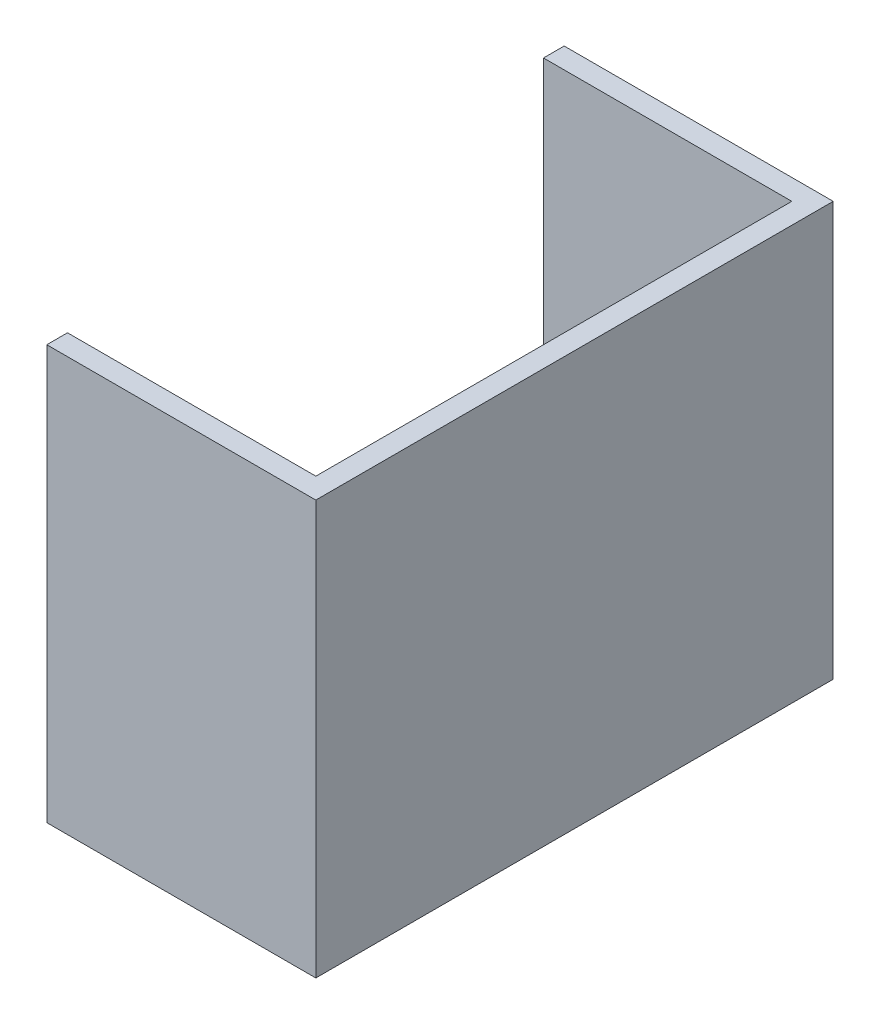
ISO-10303-21;
HEADER;
FILE_DESCRIPTION(('STEP AP214'),'2;1');
FILE_NAME('part.step','',(''),(''),'','','');
FILE_SCHEMA(('AUTOMOTIVE_DESIGN { 1 0 10303 214 1 1 1 1 }'));
ENDSEC;
DATA;
#1=APPLICATION_CONTEXT('core data for automotive mechanical design processes');
#2=APPLICATION_PROTOCOL_DEFINITION('international standard','automotive_design',2000,#1);
#3=PRODUCT_CONTEXT('',#1,'mechanical');
#4=PRODUCT('Part','Part','',(#3));
#5=PRODUCT_RELATED_PRODUCT_CATEGORY('part','',(#4));
#6=PRODUCT_DEFINITION_FORMATION('','',#4);
#7=PRODUCT_DEFINITION_CONTEXT('part definition',#1,'design');
#8=PRODUCT_DEFINITION('design','',#6,#7);
#9=PRODUCT_DEFINITION_SHAPE('','',#8);
#10=(LENGTH_UNIT() NAMED_UNIT(*) SI_UNIT(.MILLI.,.METRE.));
#11=(NAMED_UNIT(*) PLANE_ANGLE_UNIT() SI_UNIT($,.RADIAN.));
#12=(NAMED_UNIT(*) SI_UNIT($,.STERADIAN.) SOLID_ANGLE_UNIT());
#13=UNCERTAINTY_MEASURE_WITH_UNIT(LENGTH_MEASURE(1.E-05),#10,'distance_accuracy_value','');
#14=(GEOMETRIC_REPRESENTATION_CONTEXT(3) GLOBAL_UNCERTAINTY_ASSIGNED_CONTEXT((#13)) GLOBAL_UNIT_ASSIGNED_CONTEXT((#10,
#11,#12)) REPRESENTATION_CONTEXT('',''));
#15=CARTESIAN_POINT('',(0.,0.,0.));
#16=DIRECTION('',(0.,0.,1.));
#17=DIRECTION('',(1.,0.,0.));
#18=AXIS2_PLACEMENT_3D('',#15,#16,#17);
#19=CARTESIAN_POINT('',(-6.,20.,12.5));
#20=DIRECTION('',(1.,0.,0.));
#21=DIRECTION('',(0.,0.,-1.));
#22=AXIS2_PLACEMENT_3D('',#19,#20,#21);
#23=PLANE('',#22);
#24=DIRECTION('',(0.,-1.,0.));
#25=VECTOR('',#24,1.);
#26=CARTESIAN_POINT('',(-6.,20.,3.50000000000001));
#27=LINE('',#26,#25);
#28=CARTESIAN_POINT('',(-6.,1.,3.50000000000001));
#29=VERTEX_POINT('',#28);
#30=CARTESIAN_POINT('',(-6.,0.,3.50000000000001));
#31=VERTEX_POINT('',#30);
#32=EDGE_CURVE('E131',#29,#31,#27,.T.);
#33=ORIENTED_EDGE('',*,*,#32,.T.);
#34=DIRECTION('',(0.,0.,1.));
#35=VECTOR('',#34,1.);
#36=CARTESIAN_POINT('',(-6.,0.,12.5));
#37=LINE('',#36,#35);
#38=CARTESIAN_POINT('',(-6.,0.,12.5));
#39=VERTEX_POINT('',#38);
#40=EDGE_CURVE('E143',#31,#39,#37,.T.);
#41=ORIENTED_EDGE('',*,*,#40,.T.);
#42=DIRECTION('',(0.,-1.,0.));
#43=VECTOR('',#42,1.);
#44=CARTESIAN_POINT('',(-6.,20.,12.5));
#45=LINE('',#44,#43);
#46=CARTESIAN_POINT('',(-6.,20.,12.5));
#47=VERTEX_POINT('',#46);
#48=EDGE_CURVE('E165',#47,#39,#45,.T.);
#49=ORIENTED_EDGE('',*,*,#48,.F.);
#50=DIRECTION('',(0.,0.,1.));
#51=VECTOR('',#50,1.);
#52=CARTESIAN_POINT('',(-6.,20.,12.5));
#53=LINE('',#52,#51);
#54=CARTESIAN_POINT('',(-5.99999999999999,20.,11.5));
#55=VERTEX_POINT('',#54);
#56=EDGE_CURVE('E215',#55,#47,#53,.T.);
#57=ORIENTED_EDGE('',*,*,#56,.F.);
#58=DIRECTION('',(0.,-1.,0.));
#59=VECTOR('',#58,1.);
#60=CARTESIAN_POINT('',(-5.99999999999999,20.,11.5));
#61=LINE('',#60,#59);
#62=CARTESIAN_POINT('',(-5.99999999999999,1.,11.5));
#63=VERTEX_POINT('',#62);
#64=EDGE_CURVE('E209',#55,#63,#61,.T.);
#65=ORIENTED_EDGE('',*,*,#64,.T.);
#66=DIRECTION('',(0.,0.,1.));
#67=VECTOR('',#66,1.);
#68=CARTESIAN_POINT('',(-6.,1.,-11.5));
#69=LINE('',#68,#67);
#70=EDGE_CURVE('E146',#29,#63,#69,.T.);
#71=ORIENTED_EDGE('',*,*,#70,.F.);
#72=EDGE_LOOP('',(#33,#41,#49,#57,#65,#71));
#73=FACE_BOUND('',#72,.T.);
#74=ADVANCED_FACE('F35',(#73),#23,.F.);
#75=CARTESIAN_POINT('',(0.,0.,0.));
#76=DIRECTION('',(0.,-1.,0.));
#77=DIRECTION('',(0.,0.,-1.));
#78=AXIS2_PLACEMENT_3D('',#75,#76,#77);
#79=PLANE('',#78);
#80=ORIENTED_EDGE('',*,*,#40,.F.);
#81=DIRECTION('',(1.,0.,0.));
#82=VECTOR('',#81,1.);
#83=CARTESIAN_POINT('',(-6.,0.,3.50000000000001));
#84=LINE('',#83,#82);
#85=CARTESIAN_POINT('',(6.,0.,3.50000000000001));
#86=VERTEX_POINT('',#85);
#87=EDGE_CURVE('E128',#31,#86,#84,.T.);
#88=ORIENTED_EDGE('',*,*,#87,.T.);
#89=DIRECTION('',(0.,0.,-1.));
#90=VECTOR('',#89,1.);
#91=CARTESIAN_POINT('',(6.,0.,3.50000000000001));
#92=LINE('',#91,#90);
#93=CARTESIAN_POINT('',(6.,0.,-5.49999999999999));
#94=VERTEX_POINT('',#93);
#95=EDGE_CURVE('E138',#86,#94,#92,.T.);
#96=ORIENTED_EDGE('',*,*,#95,.T.);
#97=CARTESIAN_POINT('',(0.,0.,-5.49999999999999));
#98=DIRECTION('',(0.,1.,0.));
#99=DIRECTION('',(0.,0.,1.));
#100=AXIS2_PLACEMENT_3D('',#97,#98,#99);
#101=CIRCLE('',#100,6.);
#102=CARTESIAN_POINT('',(-6.,0.,-5.49999999999999));
#103=VERTEX_POINT('',#102);
#104=EDGE_CURVE('E255',#94,#103,#101,.T.);
#105=ORIENTED_EDGE('',*,*,#104,.T.);
#106=CARTESIAN_POINT('',(-6.,0.,-12.5));
#107=VERTEX_POINT('',#106);
#108=EDGE_CURVE('E152',#107,#103,#37,.T.);
#109=ORIENTED_EDGE('',*,*,#108,.F.);
#110=DIRECTION('',(-1.,0.,0.));
#111=VECTOR('',#110,1.);
#112=CARTESIAN_POINT('',(-6.,0.,-12.5));
#113=LINE('',#112,#111);
#114=CARTESIAN_POINT('',(7.,0.,-12.5));
#115=VERTEX_POINT('',#114);
#116=EDGE_CURVE('E153',#115,#107,#113,.T.);
#117=ORIENTED_EDGE('',*,*,#116,.F.);
#118=DIRECTION('',(0.,0.,-1.));
#119=VECTOR('',#118,1.);
#120=CARTESIAN_POINT('',(7.,0.,12.5));
#121=LINE('',#120,#119);
#122=CARTESIAN_POINT('',(7.,0.,12.5));
#123=VERTEX_POINT('',#122);
#124=EDGE_CURVE('E156',#123,#115,#121,.T.);
#125=ORIENTED_EDGE('',*,*,#124,.F.);
#126=DIRECTION('',(1.,0.,0.));
#127=VECTOR('',#126,1.);
#128=CARTESIAN_POINT('',(-6.,0.,12.5));
#129=LINE('',#128,#127);
#130=EDGE_CURVE('E151',#39,#123,#129,.T.);
#131=ORIENTED_EDGE('',*,*,#130,.F.);
#132=EDGE_LOOP('',(#80,#88,#96,#105,#109,#117,#125,#131));
#133=FACE_BOUND('',#132,.T.);
#134=ADVANCED_FACE('F149',(#133),#79,.T.);
#135=CARTESIAN_POINT('',(0.,1.,0.));
#136=DIRECTION('',(0.,1.,0.));
#137=DIRECTION('',(0.,0.,1.));
#138=AXIS2_PLACEMENT_3D('',#135,#136,#137);
#139=PLANE('',#138);
#140=DIRECTION('',(0.,0.,-1.));
#141=VECTOR('',#140,1.);
#142=CARTESIAN_POINT('',(6.,1.,-11.5));
#143=LINE('',#142,#141);
#144=CARTESIAN_POINT('',(6.00000000000001,1.,11.5));
#145=VERTEX_POINT('',#144);
#146=CARTESIAN_POINT('',(6.,1.,3.50000000000001));
#147=VERTEX_POINT('',#146);
#148=EDGE_CURVE('E193',#145,#147,#143,.T.);
#149=ORIENTED_EDGE('',*,*,#148,.T.);
#150=DIRECTION('',(-1.,0.,0.));
#151=VECTOR('',#150,1.);
#152=CARTESIAN_POINT('',(0.,1.,3.50000000000001));
#153=LINE('',#152,#151);
#154=EDGE_CURVE('E11',#147,#29,#153,.T.);
#155=ORIENTED_EDGE('',*,*,#154,.T.);
#156=ORIENTED_EDGE('',*,*,#70,.T.);
#157=DIRECTION('',(1.,0.,0.));
#158=VECTOR('',#157,1.);
#159=CARTESIAN_POINT('',(-5.99999999999999,1.,11.5));
#160=LINE('',#159,#158);
#161=EDGE_CURVE('E240',#63,#145,#160,.T.);
#162=ORIENTED_EDGE('',*,*,#161,.T.);
#163=EDGE_LOOP('',(#149,#155,#156,#162));
#164=FACE_BOUND('',#163,.T.);
#165=ADVANCED_FACE('F248',(#164),#139,.T.);
#166=CARTESIAN_POINT('',(-6.,1.,-11.5));
#167=VERTEX_POINT('',#166);
#168=CARTESIAN_POINT('',(-6.,1.,-5.49999999999999));
#169=VERTEX_POINT('',#168);
#170=EDGE_CURVE('E185',#167,#169,#69,.T.);
#171=ORIENTED_EDGE('',*,*,#170,.T.);
#172=CARTESIAN_POINT('',(0.,1.,-5.49999999999999));
#173=DIRECTION('',(0.,1.,0.));
#174=DIRECTION('',(0.,0.,1.));
#175=AXIS2_PLACEMENT_3D('',#172,#173,#174);
#176=CIRCLE('',#175,6.);
#177=CARTESIAN_POINT('',(0.,1.,-11.5));
#178=VERTEX_POINT('',#177);
#179=EDGE_CURVE('E43',#169,#178,#176,.F.);
#180=ORIENTED_EDGE('',*,*,#179,.T.);
#181=DIRECTION('',(-1.,0.,0.));
#182=VECTOR('',#181,1.);
#183=CARTESIAN_POINT('',(-6.,1.,-11.5));
#184=LINE('',#183,#182);
#185=EDGE_CURVE('E182',#178,#167,#184,.T.);
#186=ORIENTED_EDGE('',*,*,#185,.T.);
#187=EDGE_LOOP('',(#171,#180,#186));
#188=FACE_BOUND('',#187,.T.);
#189=ADVANCED_FACE('F181',(#188),#139,.T.);
#190=CARTESIAN_POINT('',(6.,1.,-11.5));
#191=VERTEX_POINT('',#190);
#192=EDGE_CURVE('E190',#191,#178,#184,.T.);
#193=ORIENTED_EDGE('',*,*,#192,.T.);
#194=CARTESIAN_POINT('',(6.,1.,-5.49999999999999));
#195=VERTEX_POINT('',#194);
#196=EDGE_CURVE('E173',#178,#195,#176,.F.);
#197=ORIENTED_EDGE('',*,*,#196,.T.);
#198=EDGE_CURVE('E196',#195,#191,#143,.T.);
#199=ORIENTED_EDGE('',*,*,#198,.T.);
#200=EDGE_LOOP('',(#193,#197,#199));
#201=FACE_BOUND('',#200,.T.);
#202=ADVANCED_FACE('F195',(#201),#139,.T.);
#203=ORIENTED_EDGE('',*,*,#108,.T.);
#204=DIRECTION('',(0.,-1.,0.));
#205=VECTOR('',#204,1.);
#206=CARTESIAN_POINT('',(-6.,20.,-5.49999999999999));
#207=LINE('',#206,#205);
#208=EDGE_CURVE('E251',#169,#103,#207,.T.);
#209=ORIENTED_EDGE('',*,*,#208,.F.);
#210=ORIENTED_EDGE('',*,*,#170,.F.);
#211=DIRECTION('',(0.,-1.,0.));
#212=VECTOR('',#211,1.);
#213=CARTESIAN_POINT('',(-6.,20.,-11.5));
#214=LINE('',#213,#212);
#215=CARTESIAN_POINT('',(-6.,20.,-11.5));
#216=VERTEX_POINT('',#215);
#217=EDGE_CURVE('E192',#216,#167,#214,.T.);
#218=ORIENTED_EDGE('',*,*,#217,.F.);
#219=CARTESIAN_POINT('',(-6.,20.,-12.5));
#220=VERTEX_POINT('',#219);
#221=EDGE_CURVE('E216',#220,#216,#53,.T.);
#222=ORIENTED_EDGE('',*,*,#221,.F.);
#223=DIRECTION('',(0.,-1.,0.));
#224=VECTOR('',#223,1.);
#225=CARTESIAN_POINT('',(-6.,20.,-12.5));
#226=LINE('',#225,#224);
#227=EDGE_CURVE('E168',#220,#107,#226,.T.);
#228=ORIENTED_EDGE('',*,*,#227,.T.);
#229=EDGE_LOOP('',(#203,#209,#210,#218,#222,#228));
#230=FACE_BOUND('',#229,.T.);
#231=ADVANCED_FACE('F258',(#230),#23,.F.);
#232=CARTESIAN_POINT('',(0.,20.,0.));
#233=DIRECTION('',(0.,-1.,0.));
#234=DIRECTION('',(0.,0.,-1.));
#235=AXIS2_PLACEMENT_3D('',#232,#233,#234);
#236=PLANE('',#235);
#237=DIRECTION('',(1.,0.,0.));
#238=VECTOR('',#237,1.);
#239=CARTESIAN_POINT('',(-5.99999999999999,20.,11.5));
#240=LINE('',#239,#238);
#241=CARTESIAN_POINT('',(6.00000000000001,20.,11.5));
#242=VERTEX_POINT('',#241);
#243=EDGE_CURVE('E197',#55,#242,#240,.T.);
#244=ORIENTED_EDGE('',*,*,#243,.F.);
#245=ORIENTED_EDGE('',*,*,#56,.T.);
#246=DIRECTION('',(1.,0.,0.));
#247=VECTOR('',#246,1.);
#248=CARTESIAN_POINT('',(-6.,20.,12.5));
#249=LINE('',#248,#247);
#250=CARTESIAN_POINT('',(7.,20.,12.5));
#251=VERTEX_POINT('',#250);
#252=EDGE_CURVE('E166',#47,#251,#249,.T.);
#253=ORIENTED_EDGE('',*,*,#252,.T.);
#254=DIRECTION('',(0.,0.,-1.));
#255=VECTOR('',#254,1.);
#256=CARTESIAN_POINT('',(7.,20.,12.5));
#257=LINE('',#256,#255);
#258=CARTESIAN_POINT('',(7.,20.,-12.5));
#259=VERTEX_POINT('',#258);
#260=EDGE_CURVE('E161',#251,#259,#257,.T.);
#261=ORIENTED_EDGE('',*,*,#260,.T.);
#262=DIRECTION('',(-1.,0.,0.));
#263=VECTOR('',#262,1.);
#264=CARTESIAN_POINT('',(-6.,20.,-12.5));
#265=LINE('',#264,#263);
#266=EDGE_CURVE('E213',#259,#220,#265,.T.);
#267=ORIENTED_EDGE('',*,*,#266,.T.);
#268=ORIENTED_EDGE('',*,*,#221,.T.);
#269=DIRECTION('',(-1.,0.,0.));
#270=VECTOR('',#269,1.);
#271=CARTESIAN_POINT('',(-6.,20.,-11.5));
#272=LINE('',#271,#270);
#273=CARTESIAN_POINT('',(6.,20.,-11.5));
#274=VERTEX_POINT('',#273);
#275=EDGE_CURVE('E204',#274,#216,#272,.T.);
#276=ORIENTED_EDGE('',*,*,#275,.F.);
#277=DIRECTION('',(0.,0.,-1.));
#278=VECTOR('',#277,1.);
#279=CARTESIAN_POINT('',(6.,20.,-11.5));
#280=LINE('',#279,#278);
#281=EDGE_CURVE('E58',#242,#274,#280,.T.);
#282=ORIENTED_EDGE('',*,*,#281,.F.);
#283=EDGE_LOOP('',(#244,#245,#253,#261,#267,#268,#276,#282));
#284=FACE_BOUND('',#283,.T.);
#285=ADVANCED_FACE('F232',(#284),#236,.F.);
#286=CARTESIAN_POINT('',(7.,20.,12.5));
#287=DIRECTION('',(-1.,0.,0.));
#288=DIRECTION('',(0.,0.,1.));
#289=AXIS2_PLACEMENT_3D('',#286,#287,#288);
#290=PLANE('',#289);
#291=ORIENTED_EDGE('',*,*,#124,.T.);
#292=DIRECTION('',(0.,-1.,0.));
#293=VECTOR('',#292,1.);
#294=CARTESIAN_POINT('',(7.,20.,-12.5));
#295=LINE('',#294,#293);
#296=EDGE_CURVE('E171',#259,#115,#295,.T.);
#297=ORIENTED_EDGE('',*,*,#296,.F.);
#298=ORIENTED_EDGE('',*,*,#260,.F.);
#299=DIRECTION('',(0.,-1.,0.));
#300=VECTOR('',#299,1.);
#301=CARTESIAN_POINT('',(7.,20.,12.5));
#302=LINE('',#301,#300);
#303=EDGE_CURVE('E162',#251,#123,#302,.T.);
#304=ORIENTED_EDGE('',*,*,#303,.T.);
#305=EDGE_LOOP('',(#291,#297,#298,#304));
#306=FACE_BOUND('',#305,.T.);
#307=ADVANCED_FACE('F37',(#306),#290,.F.);
#308=CARTESIAN_POINT('',(-6.,20.,-12.5));
#309=DIRECTION('',(0.,0.,1.));
#310=DIRECTION('',(1.,0.,0.));
#311=AXIS2_PLACEMENT_3D('',#308,#309,#310);
#312=PLANE('',#311);
#313=ORIENTED_EDGE('',*,*,#116,.T.);
#314=ORIENTED_EDGE('',*,*,#227,.F.);
#315=ORIENTED_EDGE('',*,*,#266,.F.);
#316=ORIENTED_EDGE('',*,*,#296,.T.);
#317=EDGE_LOOP('',(#313,#314,#315,#316));
#318=FACE_BOUND('',#317,.T.);
#319=ADVANCED_FACE('F228',(#318),#312,.F.);
#320=CARTESIAN_POINT('',(-6.,20.,12.5));
#321=DIRECTION('',(0.,0.,-1.));
#322=DIRECTION('',(-1.,0.,0.));
#323=AXIS2_PLACEMENT_3D('',#320,#321,#322);
#324=PLANE('',#323);
#325=ORIENTED_EDGE('',*,*,#130,.T.);
#326=ORIENTED_EDGE('',*,*,#303,.F.);
#327=ORIENTED_EDGE('',*,*,#252,.F.);
#328=ORIENTED_EDGE('',*,*,#48,.T.);
#329=EDGE_LOOP('',(#325,#326,#327,#328));
#330=FACE_BOUND('',#329,.T.);
#331=ADVANCED_FACE('F236',(#330),#324,.F.);
#332=CARTESIAN_POINT('',(-5.99999999999999,20.,11.5));
#333=DIRECTION('',(0.,0.,-1.));
#334=DIRECTION('',(-1.,0.,0.));
#335=AXIS2_PLACEMENT_3D('',#332,#333,#334);
#336=PLANE('',#335);
#337=ORIENTED_EDGE('',*,*,#161,.F.);
#338=ORIENTED_EDGE('',*,*,#64,.F.);
#339=ORIENTED_EDGE('',*,*,#243,.T.);
#340=DIRECTION('',(0.,-1.,0.));
#341=VECTOR('',#340,1.);
#342=CARTESIAN_POINT('',(6.00000000000001,20.,11.5));
#343=LINE('',#342,#341);
#344=EDGE_CURVE('E206',#242,#145,#343,.T.);
#345=ORIENTED_EDGE('',*,*,#344,.T.);
#346=EDGE_LOOP('',(#337,#338,#339,#345));
#347=FACE_BOUND('',#346,.T.);
#348=ADVANCED_FACE('F239',(#347),#336,.T.);
#349=CARTESIAN_POINT('',(6.,20.,-11.5));
#350=DIRECTION('',(-1.,0.,0.));
#351=DIRECTION('',(0.,0.,1.));
#352=AXIS2_PLACEMENT_3D('',#349,#350,#351);
#353=PLANE('',#352);
#354=DIRECTION('',(0.,-1.,0.));
#355=VECTOR('',#354,1.);
#356=CARTESIAN_POINT('',(6.,20.,3.50000000000001));
#357=LINE('',#356,#355);
#358=EDGE_CURVE('E133',#147,#86,#357,.T.);
#359=ORIENTED_EDGE('',*,*,#358,.F.);
#360=ORIENTED_EDGE('',*,*,#148,.F.);
#361=ORIENTED_EDGE('',*,*,#344,.F.);
#362=ORIENTED_EDGE('',*,*,#281,.T.);
#363=DIRECTION('',(0.,-1.,0.));
#364=VECTOR('',#363,1.);
#365=CARTESIAN_POINT('',(6.,20.,-11.5));
#366=LINE('',#365,#364);
#367=EDGE_CURVE('E203',#274,#191,#366,.T.);
#368=ORIENTED_EDGE('',*,*,#367,.T.);
#369=ORIENTED_EDGE('',*,*,#198,.F.);
#370=DIRECTION('',(0.,-1.,0.));
#371=VECTOR('',#370,1.);
#372=CARTESIAN_POINT('',(6.,20.,-5.49999999999999));
#373=LINE('',#372,#371);
#374=EDGE_CURVE('E50',#195,#94,#373,.T.);
#375=ORIENTED_EDGE('',*,*,#374,.T.);
#376=ORIENTED_EDGE('',*,*,#95,.F.);
#377=EDGE_LOOP('',(#359,#360,#361,#362,#368,#369,#375,#376));
#378=FACE_BOUND('',#377,.T.);
#379=ADVANCED_FACE('F249',(#378),#353,.T.);
#380=CARTESIAN_POINT('',(-6.,20.,-11.5));
#381=DIRECTION('',(0.,0.,1.));
#382=DIRECTION('',(1.,0.,0.));
#383=AXIS2_PLACEMENT_3D('',#380,#381,#382);
#384=PLANE('',#383);
#385=ORIENTED_EDGE('',*,*,#275,.T.);
#386=ORIENTED_EDGE('',*,*,#217,.T.);
#387=ORIENTED_EDGE('',*,*,#185,.F.);
#388=ORIENTED_EDGE('',*,*,#192,.F.);
#389=ORIENTED_EDGE('',*,*,#367,.F.);
#390=EDGE_LOOP('',(#385,#386,#387,#388,#389));
#391=FACE_BOUND('',#390,.T.);
#392=ADVANCED_FACE('F189',(#391),#384,.T.);
#393=CARTESIAN_POINT('',(-6.,20.,3.50000000000001));
#394=DIRECTION('',(0.,0.,-1.));
#395=DIRECTION('',(-1.,0.,0.));
#396=AXIS2_PLACEMENT_3D('',#393,#394,#395);
#397=PLANE('',#396);
#398=ORIENTED_EDGE('',*,*,#358,.T.);
#399=ORIENTED_EDGE('',*,*,#87,.F.);
#400=ORIENTED_EDGE('',*,*,#32,.F.);
#401=ORIENTED_EDGE('',*,*,#154,.F.);
#402=EDGE_LOOP('',(#398,#399,#400,#401));
#403=FACE_BOUND('',#402,.T.);
#404=ADVANCED_FACE('F130',(#403),#397,.T.);
#405=CARTESIAN_POINT('',(0.,20.,-5.49999999999999));
#406=DIRECTION('',(0.,-1.,0.));
#407=DIRECTION('',(0.,0.,-1.));
#408=AXIS2_PLACEMENT_3D('',#405,#406,#407);
#409=CYLINDRICAL_SURFACE('',#408,6.);
#410=ORIENTED_EDGE('',*,*,#208,.T.);
#411=ORIENTED_EDGE('',*,*,#104,.F.);
#412=ORIENTED_EDGE('',*,*,#374,.F.);
#413=ORIENTED_EDGE('',*,*,#196,.F.);
#414=ORIENTED_EDGE('',*,*,#179,.F.);
#415=EDGE_LOOP('',(#410,#411,#412,#413,#414));
#416=FACE_BOUND('',#415,.T.);
#417=ADVANCED_FACE('F259',(#416),#409,.F.);
#418=CLOSED_SHELL('',(#74,#134,#165,#189,#202,#231,#285,#307,#319,#331,#348,#379,#392,#404,#417));
#419=MANIFOLD_SOLID_BREP('B2',#418);
#420=ADVANCED_BREP_SHAPE_REPRESENTATION('',(#18,#419),#14);
#421=SHAPE_DEFINITION_REPRESENTATION(#9,#420);
ENDSEC;
END-ISO-10303-21;
